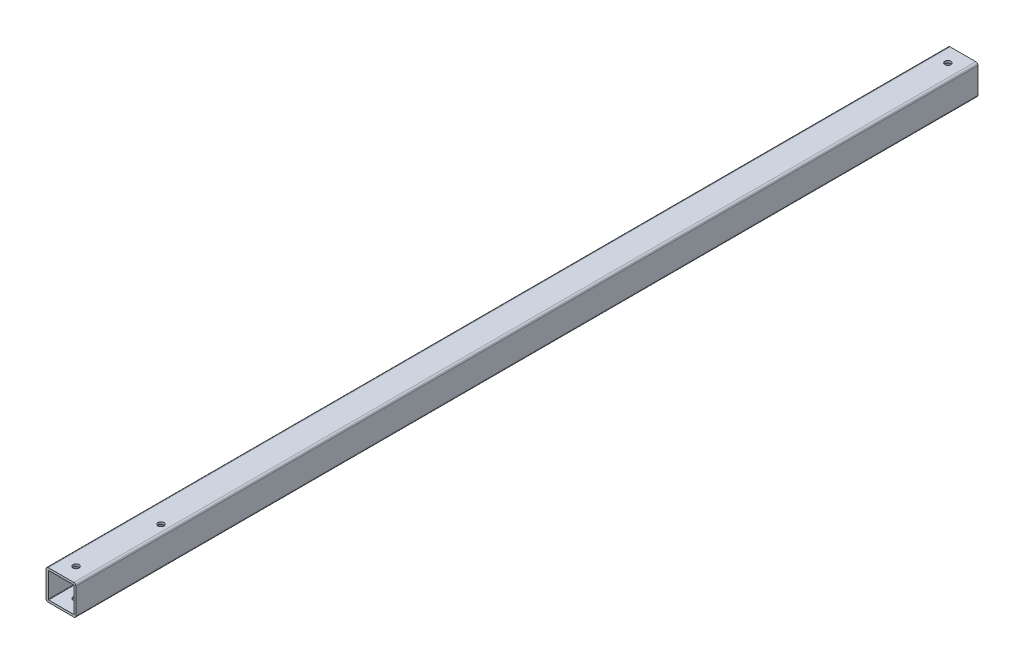
ISO-10303-21;
HEADER;
FILE_DESCRIPTION(('STEP AP214'),'2;1');
FILE_NAME('part.step','',(''),(''),'','','');
FILE_SCHEMA(('AUTOMOTIVE_DESIGN { 1 0 10303 214 1 1 1 1 }'));
ENDSEC;
DATA;
#1=APPLICATION_CONTEXT('core data for automotive mechanical design processes');
#2=APPLICATION_PROTOCOL_DEFINITION('international standard','automotive_design',2000,#1);
#3=PRODUCT_CONTEXT('',#1,'mechanical');
#4=PRODUCT('Part','Part','',(#3));
#5=PRODUCT_RELATED_PRODUCT_CATEGORY('part','',(#4));
#6=PRODUCT_DEFINITION_FORMATION('','',#4);
#7=PRODUCT_DEFINITION_CONTEXT('part definition',#1,'design');
#8=PRODUCT_DEFINITION('design','',#6,#7);
#9=PRODUCT_DEFINITION_SHAPE('','',#8);
#10=(LENGTH_UNIT() NAMED_UNIT(*) SI_UNIT(.MILLI.,.METRE.));
#11=(NAMED_UNIT(*) PLANE_ANGLE_UNIT() SI_UNIT($,.RADIAN.));
#12=(NAMED_UNIT(*) SI_UNIT($,.STERADIAN.) SOLID_ANGLE_UNIT());
#13=UNCERTAINTY_MEASURE_WITH_UNIT(LENGTH_MEASURE(1.E-05),#10,'distance_accuracy_value','');
#14=(GEOMETRIC_REPRESENTATION_CONTEXT(3) GLOBAL_UNCERTAINTY_ASSIGNED_CONTEXT((#13)) GLOBAL_UNIT_ASSIGNED_CONTEXT((#10,
#11,#12)) REPRESENTATION_CONTEXT('',''));
#15=CARTESIAN_POINT('',(0.,0.,0.));
#16=DIRECTION('',(0.,0.,1.));
#17=DIRECTION('',(1.,0.,0.));
#18=AXIS2_PLACEMENT_3D('',#15,#16,#17);
#19=CARTESIAN_POINT('',(0.,0.,1200.));
#20=DIRECTION('',(0.,0.,1.));
#21=DIRECTION('',(1.,0.,0.));
#22=AXIS2_PLACEMENT_3D('',#19,#20,#21);
#23=PLANE('',#22);
#24=DIRECTION('',(1.,0.,0.));
#25=VECTOR('',#24,1.);
#26=CARTESIAN_POINT('',(-20.,-20.,1200.));
#27=LINE('',#26,#25);
#28=CARTESIAN_POINT('',(-17.,-20.,1200.));
#29=VERTEX_POINT('',#28);
#30=CARTESIAN_POINT('',(17.,-20.,1200.));
#31=VERTEX_POINT('',#30);
#32=EDGE_CURVE('E199',#29,#31,#27,.T.);
#33=ORIENTED_EDGE('',*,*,#32,.T.);
#34=CARTESIAN_POINT('',(17.,-17.,1200.));
#35=DIRECTION('',(0.,0.,1.));
#36=DIRECTION('',(1.,0.,0.));
#37=AXIS2_PLACEMENT_3D('',#34,#35,#36);
#38=CIRCLE('',#37,3.);
#39=CARTESIAN_POINT('',(20.,-17.,1200.));
#40=VERTEX_POINT('',#39);
#41=EDGE_CURVE('E258',#31,#40,#38,.T.);
#42=ORIENTED_EDGE('',*,*,#41,.T.);
#43=DIRECTION('',(0.,1.,0.));
#44=VECTOR('',#43,1.);
#45=CARTESIAN_POINT('',(20.,20.,1200.));
#46=LINE('',#45,#44);
#47=CARTESIAN_POINT('',(20.,17.,1200.));
#48=VERTEX_POINT('',#47);
#49=EDGE_CURVE('E311',#40,#48,#46,.T.);
#50=ORIENTED_EDGE('',*,*,#49,.T.);
#51=CARTESIAN_POINT('',(17.,17.,1200.));
#52=DIRECTION('',(0.,0.,1.));
#53=DIRECTION('',(1.,0.,0.));
#54=AXIS2_PLACEMENT_3D('',#51,#52,#53);
#55=CIRCLE('',#54,3.);
#56=CARTESIAN_POINT('',(17.,20.,1200.));
#57=VERTEX_POINT('',#56);
#58=EDGE_CURVE('E254',#48,#57,#55,.T.);
#59=ORIENTED_EDGE('',*,*,#58,.T.);
#60=DIRECTION('',(-1.,0.,0.));
#61=VECTOR('',#60,1.);
#62=CARTESIAN_POINT('',(-20.,20.,1200.));
#63=LINE('',#62,#61);
#64=CARTESIAN_POINT('',(-17.,20.,1200.));
#65=VERTEX_POINT('',#64);
#66=EDGE_CURVE('E314',#57,#65,#63,.T.);
#67=ORIENTED_EDGE('',*,*,#66,.T.);
#68=CARTESIAN_POINT('',(-17.,17.,1200.));
#69=DIRECTION('',(0.,0.,1.));
#70=DIRECTION('',(1.,0.,0.));
#71=AXIS2_PLACEMENT_3D('',#68,#69,#70);
#72=CIRCLE('',#71,3.);
#73=CARTESIAN_POINT('',(-20.,17.,1200.));
#74=VERTEX_POINT('',#73);
#75=EDGE_CURVE('E80',#65,#74,#72,.T.);
#76=ORIENTED_EDGE('',*,*,#75,.T.);
#77=DIRECTION('',(0.,-1.,0.));
#78=VECTOR('',#77,1.);
#79=CARTESIAN_POINT('',(-20.,20.,1200.));
#80=LINE('',#79,#78);
#81=CARTESIAN_POINT('',(-20.,-17.,1200.));
#82=VERTEX_POINT('',#81);
#83=EDGE_CURVE('E204',#74,#82,#80,.T.);
#84=ORIENTED_EDGE('',*,*,#83,.T.);
#85=CARTESIAN_POINT('',(-17.,-17.,1200.));
#86=DIRECTION('',(0.,0.,1.));
#87=DIRECTION('',(1.,0.,0.));
#88=AXIS2_PLACEMENT_3D('',#85,#86,#87);
#89=CIRCLE('',#88,3.);
#90=EDGE_CURVE('E256',#82,#29,#89,.T.);
#91=ORIENTED_EDGE('',*,*,#90,.T.);
#92=EDGE_LOOP('',(#33,#42,#50,#59,#67,#76,#84,#91));
#93=FACE_BOUND('',#92,.T.);
#94=DIRECTION('',(-1.,0.,0.));
#95=VECTOR('',#94,1.);
#96=CARTESIAN_POINT('',(-20.,17.,1200.));
#97=LINE('',#96,#95);
#98=CARTESIAN_POINT('',(16.5,17.,1200.));
#99=VERTEX_POINT('',#98);
#100=CARTESIAN_POINT('',(-16.5,17.,1200.));
#101=VERTEX_POINT('',#100);
#102=EDGE_CURVE('E298',#99,#101,#97,.T.);
#103=ORIENTED_EDGE('',*,*,#102,.F.);
#104=CARTESIAN_POINT('',(16.5,16.5,1200.));
#105=DIRECTION('',(0.,0.,1.));
#106=DIRECTION('',(1.,0.,0.));
#107=AXIS2_PLACEMENT_3D('',#104,#105,#106);
#108=CIRCLE('',#107,0.5);
#109=CARTESIAN_POINT('',(17.,16.5,1200.));
#110=VERTEX_POINT('',#109);
#111=EDGE_CURVE('E229',#99,#110,#108,.F.);
#112=ORIENTED_EDGE('',*,*,#111,.T.);
#113=DIRECTION('',(0.,1.,0.));
#114=VECTOR('',#113,1.);
#115=CARTESIAN_POINT('',(17.,20.,1200.));
#116=LINE('',#115,#114);
#117=CARTESIAN_POINT('',(17.,-16.5,1200.));
#118=VERTEX_POINT('',#117);
#119=EDGE_CURVE('E295',#118,#110,#116,.T.);
#120=ORIENTED_EDGE('',*,*,#119,.F.);
#121=CARTESIAN_POINT('',(16.5,-16.5,1200.));
#122=DIRECTION('',(0.,0.,1.));
#123=DIRECTION('',(1.,0.,0.));
#124=AXIS2_PLACEMENT_3D('',#121,#122,#123);
#125=CIRCLE('',#124,0.5);
#126=CARTESIAN_POINT('',(16.5,-17.,1200.));
#127=VERTEX_POINT('',#126);
#128=EDGE_CURVE('E233',#118,#127,#125,.F.);
#129=ORIENTED_EDGE('',*,*,#128,.T.);
#130=DIRECTION('',(1.,0.,0.));
#131=VECTOR('',#130,1.);
#132=CARTESIAN_POINT('',(-20.,-17.,1200.));
#133=LINE('',#132,#131);
#134=CARTESIAN_POINT('',(-16.5,-17.,1200.));
#135=VERTEX_POINT('',#134);
#136=EDGE_CURVE('E303',#135,#127,#133,.T.);
#137=ORIENTED_EDGE('',*,*,#136,.F.);
#138=CARTESIAN_POINT('',(-16.5,-16.5,1200.));
#139=DIRECTION('',(0.,0.,1.));
#140=DIRECTION('',(1.,0.,0.));
#141=AXIS2_PLACEMENT_3D('',#138,#139,#140);
#142=CIRCLE('',#141,0.5);
#143=CARTESIAN_POINT('',(-17.,-16.5,1200.));
#144=VERTEX_POINT('',#143);
#145=EDGE_CURVE('E185',#135,#144,#142,.F.);
#146=ORIENTED_EDGE('',*,*,#145,.T.);
#147=DIRECTION('',(0.,-1.,0.));
#148=VECTOR('',#147,1.);
#149=CARTESIAN_POINT('',(-17.,20.,1200.));
#150=LINE('',#149,#148);
#151=CARTESIAN_POINT('',(-17.,16.5,1200.));
#152=VERTEX_POINT('',#151);
#153=EDGE_CURVE('E301',#152,#144,#150,.T.);
#154=ORIENTED_EDGE('',*,*,#153,.F.);
#155=CARTESIAN_POINT('',(-16.5,16.5,1200.));
#156=DIRECTION('',(0.,0.,1.));
#157=DIRECTION('',(1.,0.,0.));
#158=AXIS2_PLACEMENT_3D('',#155,#156,#157);
#159=CIRCLE('',#158,0.5);
#160=EDGE_CURVE('E184',#152,#101,#159,.F.);
#161=ORIENTED_EDGE('',*,*,#160,.T.);
#162=EDGE_LOOP('',(#103,#112,#120,#129,#137,#146,#154,#161));
#163=FACE_BOUND('',#162,.T.);
#164=ADVANCED_FACE('F56',(#93,#163),#23,.T.);
#165=CARTESIAN_POINT('',(0.,0.,0.));
#166=DIRECTION('',(0.,0.,1.));
#167=DIRECTION('',(1.,0.,0.));
#168=AXIS2_PLACEMENT_3D('',#165,#166,#167);
#169=PLANE('',#168);
#170=DIRECTION('',(0.,1.,0.));
#171=VECTOR('',#170,1.);
#172=CARTESIAN_POINT('',(20.,20.,0.));
#173=LINE('',#172,#171);
#174=CARTESIAN_POINT('',(20.,-17.,0.));
#175=VERTEX_POINT('',#174);
#176=CARTESIAN_POINT('',(20.,17.,0.));
#177=VERTEX_POINT('',#176);
#178=EDGE_CURVE('E306',#175,#177,#173,.T.);
#179=ORIENTED_EDGE('',*,*,#178,.F.);
#180=CARTESIAN_POINT('',(17.,-17.,0.));
#181=DIRECTION('',(0.,0.,1.));
#182=DIRECTION('',(1.,0.,0.));
#183=AXIS2_PLACEMENT_3D('',#180,#181,#182);
#184=CIRCLE('',#183,3.);
#185=CARTESIAN_POINT('',(17.,-20.,0.));
#186=VERTEX_POINT('',#185);
#187=EDGE_CURVE('E246',#175,#186,#184,.F.);
#188=ORIENTED_EDGE('',*,*,#187,.T.);
#189=DIRECTION('',(1.,0.,0.));
#190=VECTOR('',#189,1.);
#191=CARTESIAN_POINT('',(-20.,-20.,0.));
#192=LINE('',#191,#190);
#193=CARTESIAN_POINT('',(-17.,-20.,0.));
#194=VERTEX_POINT('',#193);
#195=EDGE_CURVE('E207',#194,#186,#192,.T.);
#196=ORIENTED_EDGE('',*,*,#195,.F.);
#197=CARTESIAN_POINT('',(-17.,-17.,0.));
#198=DIRECTION('',(0.,0.,1.));
#199=DIRECTION('',(1.,0.,0.));
#200=AXIS2_PLACEMENT_3D('',#197,#198,#199);
#201=CIRCLE('',#200,3.);
#202=CARTESIAN_POINT('',(-20.,-17.,0.));
#203=VERTEX_POINT('',#202);
#204=EDGE_CURVE('E244',#194,#203,#201,.F.);
#205=ORIENTED_EDGE('',*,*,#204,.T.);
#206=DIRECTION('',(0.,-1.,0.));
#207=VECTOR('',#206,1.);
#208=CARTESIAN_POINT('',(-20.,20.,0.));
#209=LINE('',#208,#207);
#210=CARTESIAN_POINT('',(-20.,17.,0.));
#211=VERTEX_POINT('',#210);
#212=EDGE_CURVE('E321',#211,#203,#209,.T.);
#213=ORIENTED_EDGE('',*,*,#212,.F.);
#214=CARTESIAN_POINT('',(-17.,17.,0.));
#215=DIRECTION('',(0.,0.,1.));
#216=DIRECTION('',(1.,0.,0.));
#217=AXIS2_PLACEMENT_3D('',#214,#215,#216);
#218=CIRCLE('',#217,3.);
#219=CARTESIAN_POINT('',(-17.,20.,0.));
#220=VERTEX_POINT('',#219);
#221=EDGE_CURVE('E240',#211,#220,#218,.F.);
#222=ORIENTED_EDGE('',*,*,#221,.T.);
#223=DIRECTION('',(-1.,0.,0.));
#224=VECTOR('',#223,1.);
#225=CARTESIAN_POINT('',(-20.,20.,0.));
#226=LINE('',#225,#224);
#227=CARTESIAN_POINT('',(17.,20.,0.));
#228=VERTEX_POINT('',#227);
#229=EDGE_CURVE('E319',#228,#220,#226,.T.);
#230=ORIENTED_EDGE('',*,*,#229,.F.);
#231=CARTESIAN_POINT('',(17.,17.,0.));
#232=DIRECTION('',(0.,0.,1.));
#233=DIRECTION('',(1.,0.,0.));
#234=AXIS2_PLACEMENT_3D('',#231,#232,#233);
#235=CIRCLE('',#234,3.);
#236=EDGE_CURVE('E242',#228,#177,#235,.F.);
#237=ORIENTED_EDGE('',*,*,#236,.T.);
#238=EDGE_LOOP('',(#179,#188,#196,#205,#213,#222,#230,#237));
#239=FACE_BOUND('',#238,.T.);
#240=DIRECTION('',(1.,0.,0.));
#241=VECTOR('',#240,1.);
#242=CARTESIAN_POINT('',(-20.,-17.,0.));
#243=LINE('',#242,#241);
#244=CARTESIAN_POINT('',(-16.5,-17.,0.));
#245=VERTEX_POINT('',#244);
#246=CARTESIAN_POINT('',(16.5,-17.,0.));
#247=VERTEX_POINT('',#246);
#248=EDGE_CURVE('E195',#245,#247,#243,.T.);
#249=ORIENTED_EDGE('',*,*,#248,.T.);
#250=CARTESIAN_POINT('',(16.5,-16.5,0.));
#251=DIRECTION('',(0.,0.,1.));
#252=DIRECTION('',(1.,0.,0.));
#253=AXIS2_PLACEMENT_3D('',#250,#251,#252);
#254=CIRCLE('',#253,0.5);
#255=CARTESIAN_POINT('',(17.,-16.5,0.));
#256=VERTEX_POINT('',#255);
#257=EDGE_CURVE('E231',#247,#256,#254,.T.);
#258=ORIENTED_EDGE('',*,*,#257,.T.);
#259=DIRECTION('',(0.,1.,0.));
#260=VECTOR('',#259,1.);
#261=CARTESIAN_POINT('',(17.,20.,0.));
#262=LINE('',#261,#260);
#263=CARTESIAN_POINT('',(17.,16.5,0.));
#264=VERTEX_POINT('',#263);
#265=EDGE_CURVE('E294',#256,#264,#262,.T.);
#266=ORIENTED_EDGE('',*,*,#265,.T.);
#267=CARTESIAN_POINT('',(16.5,16.5,0.));
#268=DIRECTION('',(0.,0.,1.));
#269=DIRECTION('',(1.,0.,0.));
#270=AXIS2_PLACEMENT_3D('',#267,#268,#269);
#271=CIRCLE('',#270,0.5);
#272=CARTESIAN_POINT('',(16.5,17.,0.));
#273=VERTEX_POINT('',#272);
#274=EDGE_CURVE('E227',#264,#273,#271,.T.);
#275=ORIENTED_EDGE('',*,*,#274,.T.);
#276=DIRECTION('',(-1.,0.,0.));
#277=VECTOR('',#276,1.);
#278=CARTESIAN_POINT('',(-20.,17.,0.));
#279=LINE('',#278,#277);
#280=CARTESIAN_POINT('',(-16.5,17.,0.));
#281=VERTEX_POINT('',#280);
#282=EDGE_CURVE('E179',#273,#281,#279,.T.);
#283=ORIENTED_EDGE('',*,*,#282,.T.);
#284=CARTESIAN_POINT('',(-16.5,16.5,0.));
#285=DIRECTION('',(0.,0.,1.));
#286=DIRECTION('',(1.,0.,0.));
#287=AXIS2_PLACEMENT_3D('',#284,#285,#286);
#288=CIRCLE('',#287,0.5);
#289=CARTESIAN_POINT('',(-17.,16.5,0.));
#290=VERTEX_POINT('',#289);
#291=EDGE_CURVE('E173',#281,#290,#288,.T.);
#292=ORIENTED_EDGE('',*,*,#291,.T.);
#293=DIRECTION('',(0.,-1.,0.));
#294=VECTOR('',#293,1.);
#295=CARTESIAN_POINT('',(-17.,20.,0.));
#296=LINE('',#295,#294);
#297=CARTESIAN_POINT('',(-17.,-16.5,0.));
#298=VERTEX_POINT('',#297);
#299=EDGE_CURVE('E177',#290,#298,#296,.T.);
#300=ORIENTED_EDGE('',*,*,#299,.T.);
#301=CARTESIAN_POINT('',(-16.5,-16.5,0.));
#302=DIRECTION('',(0.,0.,1.));
#303=DIRECTION('',(1.,0.,0.));
#304=AXIS2_PLACEMENT_3D('',#301,#302,#303);
#305=CIRCLE('',#304,0.5);
#306=EDGE_CURVE('E223',#298,#245,#305,.T.);
#307=ORIENTED_EDGE('',*,*,#306,.T.);
#308=EDGE_LOOP('',(#249,#258,#266,#275,#283,#292,#300,#307));
#309=FACE_BOUND('',#308,.T.);
#310=ADVANCED_FACE('F176',(#239,#309),#169,.F.);
#311=CARTESIAN_POINT('',(20.,20.,1200.));
#312=DIRECTION('',(-1.,0.,0.));
#313=DIRECTION('',(0.,-1.,0.));
#314=AXIS2_PLACEMENT_3D('',#311,#312,#313);
#315=PLANE('',#314);
#316=ORIENTED_EDGE('',*,*,#49,.F.);
#317=DIRECTION('',(0.,0.,-1.));
#318=VECTOR('',#317,1.);
#319=CARTESIAN_POINT('',(20.,-17.,1200.));
#320=LINE('',#319,#318);
#321=EDGE_CURVE('E237',#40,#175,#320,.T.);
#322=ORIENTED_EDGE('',*,*,#321,.T.);
#323=ORIENTED_EDGE('',*,*,#178,.T.);
#324=DIRECTION('',(0.,0.,-1.));
#325=VECTOR('',#324,1.);
#326=CARTESIAN_POINT('',(20.,17.,1200.));
#327=LINE('',#326,#325);
#328=EDGE_CURVE('E235',#177,#48,#327,.F.);
#329=ORIENTED_EDGE('',*,*,#328,.T.);
#330=EDGE_LOOP('',(#316,#322,#323,#329));
#331=FACE_BOUND('',#330,.T.);
#332=ADVANCED_FACE('F339',(#331),#315,.F.);
#333=CARTESIAN_POINT('',(-20.,20.,1200.));
#334=DIRECTION('',(0.,-1.,0.));
#335=DIRECTION('',(0.,0.,-1.));
#336=AXIS2_PLACEMENT_3D('',#333,#334,#335);
#337=PLANE('',#336);
#338=CARTESIAN_POINT('',(8.,20.,1075.));
#339=DIRECTION('',(0.,1.,0.));
#340=DIRECTION('',(0.,0.,1.));
#341=AXIS2_PLACEMENT_3D('',#338,#339,#340);
#342=CIRCLE('',#341,4.);
#343=CARTESIAN_POINT('',(8.,20.,1079.));
#344=VERTEX_POINT('',#343);
#345=EDGE_CURVE('E456',#344,#344,#342,.T.);
#346=ORIENTED_EDGE('',*,*,#345,.F.);
#347=EDGE_LOOP('',(#346));
#348=FACE_BOUND('',#347,.T.);
#349=CARTESIAN_POINT('',(0.,20.,20.));
#350=DIRECTION('',(0.,1.,0.));
#351=DIRECTION('',(0.,0.,1.));
#352=AXIS2_PLACEMENT_3D('',#349,#350,#351);
#353=CIRCLE('',#352,3.99999999999999);
#354=CARTESIAN_POINT('',(0.,20.,24.));
#355=VERTEX_POINT('',#354);
#356=EDGE_CURVE('E274',#355,#355,#353,.T.);
#357=ORIENTED_EDGE('',*,*,#356,.F.);
#358=EDGE_LOOP('',(#357));
#359=FACE_BOUND('',#358,.T.);
#360=CARTESIAN_POINT('',(1.44508322299388E-13,20.,1180.));
#361=DIRECTION('',(0.,1.,0.));
#362=DIRECTION('',(0.,0.,1.));
#363=AXIS2_PLACEMENT_3D('',#360,#361,#362);
#364=CIRCLE('',#363,3.99999999999999);
#365=CARTESIAN_POINT('',(1.44508322299388E-13,20.,1184.));
#366=VERTEX_POINT('',#365);
#367=EDGE_CURVE('E271',#366,#366,#364,.T.);
#368=ORIENTED_EDGE('',*,*,#367,.F.);
#369=EDGE_LOOP('',(#368));
#370=FACE_BOUND('',#369,.T.);
#371=ORIENTED_EDGE('',*,*,#66,.F.);
#372=DIRECTION('',(0.,0.,-1.));
#373=VECTOR('',#372,1.);
#374=CARTESIAN_POINT('',(17.,20.,1200.));
#375=LINE('',#374,#373);
#376=EDGE_CURVE('E12',#57,#228,#375,.T.);
#377=ORIENTED_EDGE('',*,*,#376,.T.);
#378=ORIENTED_EDGE('',*,*,#229,.T.);
#379=DIRECTION('',(0.,0.,-1.));
#380=VECTOR('',#379,1.);
#381=CARTESIAN_POINT('',(-17.,20.,1200.));
#382=LINE('',#381,#380);
#383=EDGE_CURVE('E65',#220,#65,#382,.F.);
#384=ORIENTED_EDGE('',*,*,#383,.T.);
#385=EDGE_LOOP('',(#371,#377,#378,#384));
#386=FACE_BOUND('',#385,.T.);
#387=ADVANCED_FACE('F347',(#348,#359,#370,#386),#337,.F.);
#388=CARTESIAN_POINT('',(-20.,20.,1200.));
#389=DIRECTION('',(1.,0.,0.));
#390=DIRECTION('',(0.,1.,0.));
#391=AXIS2_PLACEMENT_3D('',#388,#389,#390);
#392=PLANE('',#391);
#393=ORIENTED_EDGE('',*,*,#212,.T.);
#394=DIRECTION('',(0.,0.,-1.));
#395=VECTOR('',#394,1.);
#396=CARTESIAN_POINT('',(-20.,-17.,1200.));
#397=LINE('',#396,#395);
#398=EDGE_CURVE('E73',#203,#82,#397,.F.);
#399=ORIENTED_EDGE('',*,*,#398,.T.);
#400=ORIENTED_EDGE('',*,*,#83,.F.);
#401=DIRECTION('',(0.,0.,-1.));
#402=VECTOR('',#401,1.);
#403=CARTESIAN_POINT('',(-20.,17.,1200.));
#404=LINE('',#403,#402);
#405=EDGE_CURVE('E260',#74,#211,#404,.T.);
#406=ORIENTED_EDGE('',*,*,#405,.T.);
#407=EDGE_LOOP('',(#393,#399,#400,#406));
#408=FACE_BOUND('',#407,.T.);
#409=ADVANCED_FACE('F352',(#408),#392,.F.);
#410=CARTESIAN_POINT('',(-20.,-20.,1200.));
#411=DIRECTION('',(0.,1.,0.));
#412=DIRECTION('',(0.,0.,1.));
#413=AXIS2_PLACEMENT_3D('',#410,#411,#412);
#414=PLANE('',#413);
#415=CARTESIAN_POINT('',(8.,-20.,1075.));
#416=DIRECTION('',(0.,1.,0.));
#417=DIRECTION('',(0.,0.,1.));
#418=AXIS2_PLACEMENT_3D('',#415,#416,#417);
#419=CIRCLE('',#418,4.);
#420=CARTESIAN_POINT('',(8.,-20.,1079.));
#421=VERTEX_POINT('',#420);
#422=EDGE_CURVE('E455',#421,#421,#419,.T.);
#423=ORIENTED_EDGE('',*,*,#422,.T.);
#424=EDGE_LOOP('',(#423));
#425=FACE_BOUND('',#424,.T.);
#426=CARTESIAN_POINT('',(0.,-20.,20.));
#427=DIRECTION('',(0.,1.,0.));
#428=DIRECTION('',(0.,0.,1.));
#429=AXIS2_PLACEMENT_3D('',#426,#427,#428);
#430=CIRCLE('',#429,3.99999999999999);
#431=CARTESIAN_POINT('',(0.,-20.,24.));
#432=VERTEX_POINT('',#431);
#433=EDGE_CURVE('E267',#432,#432,#430,.T.);
#434=ORIENTED_EDGE('',*,*,#433,.T.);
#435=EDGE_LOOP('',(#434));
#436=FACE_BOUND('',#435,.T.);
#437=CARTESIAN_POINT('',(1.44508322299388E-13,-20.,1180.));
#438=DIRECTION('',(0.,1.,0.));
#439=DIRECTION('',(0.,0.,1.));
#440=AXIS2_PLACEMENT_3D('',#437,#438,#439);
#441=CIRCLE('',#440,3.99999999999999);
#442=CARTESIAN_POINT('',(1.44508322299388E-13,-20.,1184.));
#443=VERTEX_POINT('',#442);
#444=EDGE_CURVE('E285',#443,#443,#441,.T.);
#445=ORIENTED_EDGE('',*,*,#444,.T.);
#446=EDGE_LOOP('',(#445));
#447=FACE_BOUND('',#446,.T.);
#448=ORIENTED_EDGE('',*,*,#195,.T.);
#449=DIRECTION('',(0.,0.,-1.));
#450=VECTOR('',#449,1.);
#451=CARTESIAN_POINT('',(17.,-20.,1200.));
#452=LINE('',#451,#450);
#453=EDGE_CURVE('E251',#186,#31,#452,.F.);
#454=ORIENTED_EDGE('',*,*,#453,.T.);
#455=ORIENTED_EDGE('',*,*,#32,.F.);
#456=DIRECTION('',(0.,0.,-1.));
#457=VECTOR('',#456,1.);
#458=CARTESIAN_POINT('',(-17.,-20.,1200.));
#459=LINE('',#458,#457);
#460=EDGE_CURVE('E248',#29,#194,#459,.T.);
#461=ORIENTED_EDGE('',*,*,#460,.T.);
#462=EDGE_LOOP('',(#448,#454,#455,#461));
#463=FACE_BOUND('',#462,.T.);
#464=ADVANCED_FACE('F327',(#425,#436,#447,#463),#414,.F.);
#465=CARTESIAN_POINT('',(17.,20.,1200.));
#466=DIRECTION('',(-1.,0.,0.));
#467=DIRECTION('',(0.,-1.,0.));
#468=AXIS2_PLACEMENT_3D('',#465,#466,#467);
#469=PLANE('',#468);
#470=ORIENTED_EDGE('',*,*,#119,.T.);
#471=DIRECTION('',(0.,0.,-1.));
#472=VECTOR('',#471,1.);
#473=CARTESIAN_POINT('',(17.,16.5,0.));
#474=LINE('',#473,#472);
#475=EDGE_CURVE('E220',#110,#264,#474,.T.);
#476=ORIENTED_EDGE('',*,*,#475,.T.);
#477=ORIENTED_EDGE('',*,*,#265,.F.);
#478=DIRECTION('',(0.,0.,-1.));
#479=VECTOR('',#478,1.);
#480=CARTESIAN_POINT('',(17.,-16.5,1200.));
#481=LINE('',#480,#479);
#482=EDGE_CURVE('E218',#256,#118,#481,.F.);
#483=ORIENTED_EDGE('',*,*,#482,.T.);
#484=EDGE_LOOP('',(#470,#476,#477,#483));
#485=FACE_BOUND('',#484,.T.);
#486=ADVANCED_FACE('F371',(#485),#469,.T.);
#487=CARTESIAN_POINT('',(-20.,17.,1200.));
#488=DIRECTION('',(0.,-1.,0.));
#489=DIRECTION('',(0.,0.,-1.));
#490=AXIS2_PLACEMENT_3D('',#487,#488,#489);
#491=PLANE('',#490);
#492=CARTESIAN_POINT('',(8.,17.,1075.));
#493=DIRECTION('',(0.,-1.,0.));
#494=DIRECTION('',(0.,0.,-1.));
#495=AXIS2_PLACEMENT_3D('',#492,#493,#494);
#496=CIRCLE('',#495,4.);
#497=CARTESIAN_POINT('',(8.,17.,1071.));
#498=VERTEX_POINT('',#497);
#499=EDGE_CURVE('E279',#498,#498,#496,.T.);
#500=ORIENTED_EDGE('',*,*,#499,.F.);
#501=EDGE_LOOP('',(#500));
#502=FACE_BOUND('',#501,.T.);
#503=CARTESIAN_POINT('',(0.,17.,20.));
#504=DIRECTION('',(0.,-1.,0.));
#505=DIRECTION('',(0.,0.,-1.));
#506=AXIS2_PLACEMENT_3D('',#503,#504,#505);
#507=CIRCLE('',#506,3.99999999999999);
#508=CARTESIAN_POINT('',(0.,17.,16.));
#509=VERTEX_POINT('',#508);
#510=EDGE_CURVE('E266',#509,#509,#507,.T.);
#511=ORIENTED_EDGE('',*,*,#510,.F.);
#512=EDGE_LOOP('',(#511));
#513=FACE_BOUND('',#512,.T.);
#514=CARTESIAN_POINT('',(1.44508322299388E-13,17.,1180.));
#515=DIRECTION('',(0.,-1.,0.));
#516=DIRECTION('',(0.,0.,-1.));
#517=AXIS2_PLACEMENT_3D('',#514,#515,#516);
#518=CIRCLE('',#517,3.99999999999999);
#519=CARTESIAN_POINT('',(1.44508322299388E-13,17.,1176.));
#520=VERTEX_POINT('',#519);
#521=EDGE_CURVE('E288',#520,#520,#518,.T.);
#522=ORIENTED_EDGE('',*,*,#521,.F.);
#523=EDGE_LOOP('',(#522));
#524=FACE_BOUND('',#523,.T.);
#525=ORIENTED_EDGE('',*,*,#102,.T.);
#526=DIRECTION('',(0.,0.,-1.));
#527=VECTOR('',#526,1.);
#528=CARTESIAN_POINT('',(-16.5,17.,0.));
#529=LINE('',#528,#527);
#530=EDGE_CURVE('E216',#101,#281,#529,.T.);
#531=ORIENTED_EDGE('',*,*,#530,.T.);
#532=ORIENTED_EDGE('',*,*,#282,.F.);
#533=DIRECTION('',(0.,0.,-1.));
#534=VECTOR('',#533,1.);
#535=CARTESIAN_POINT('',(16.5,17.,1200.));
#536=LINE('',#535,#534);
#537=EDGE_CURVE('E214',#273,#99,#536,.F.);
#538=ORIENTED_EDGE('',*,*,#537,.T.);
#539=EDGE_LOOP('',(#525,#531,#532,#538));
#540=FACE_BOUND('',#539,.T.);
#541=ADVANCED_FACE('F411',(#502,#513,#524,#540),#491,.T.);
#542=CARTESIAN_POINT('',(-17.,20.,1200.));
#543=DIRECTION('',(1.,0.,0.));
#544=DIRECTION('',(0.,1.,0.));
#545=AXIS2_PLACEMENT_3D('',#542,#543,#544);
#546=PLANE('',#545);
#547=ORIENTED_EDGE('',*,*,#153,.T.);
#548=DIRECTION('',(0.,0.,-1.));
#549=VECTOR('',#548,1.);
#550=CARTESIAN_POINT('',(-17.,-16.5,0.));
#551=LINE('',#550,#549);
#552=EDGE_CURVE('E194',#144,#298,#551,.T.);
#553=ORIENTED_EDGE('',*,*,#552,.T.);
#554=ORIENTED_EDGE('',*,*,#299,.F.);
#555=DIRECTION('',(0.,0.,-1.));
#556=VECTOR('',#555,1.);
#557=CARTESIAN_POINT('',(-17.,16.5,1200.));
#558=LINE('',#557,#556);
#559=EDGE_CURVE('E191',#290,#152,#558,.F.);
#560=ORIENTED_EDGE('',*,*,#559,.T.);
#561=EDGE_LOOP('',(#547,#553,#554,#560));
#562=FACE_BOUND('',#561,.T.);
#563=ADVANCED_FACE('F190',(#562),#546,.T.);
#564=CARTESIAN_POINT('',(-20.,-17.,1200.));
#565=DIRECTION('',(0.,1.,0.));
#566=DIRECTION('',(0.,0.,1.));
#567=AXIS2_PLACEMENT_3D('',#564,#565,#566);
#568=PLANE('',#567);
#569=CARTESIAN_POINT('',(8.,-17.,1075.));
#570=DIRECTION('',(0.,1.,0.));
#571=DIRECTION('',(0.,0.,1.));
#572=AXIS2_PLACEMENT_3D('',#569,#570,#571);
#573=CIRCLE('',#572,4.);
#574=CARTESIAN_POINT('',(8.,-17.,1079.));
#575=VERTEX_POINT('',#574);
#576=EDGE_CURVE('E60',#575,#575,#573,.T.);
#577=ORIENTED_EDGE('',*,*,#576,.F.);
#578=EDGE_LOOP('',(#577));
#579=FACE_BOUND('',#578,.T.);
#580=CARTESIAN_POINT('',(0.,-17.,20.));
#581=DIRECTION('',(0.,1.,0.));
#582=DIRECTION('',(0.,0.,1.));
#583=AXIS2_PLACEMENT_3D('',#580,#581,#582);
#584=CIRCLE('',#583,3.99999999999999);
#585=CARTESIAN_POINT('',(0.,-17.,24.));
#586=VERTEX_POINT('',#585);
#587=EDGE_CURVE('E264',#586,#586,#584,.T.);
#588=ORIENTED_EDGE('',*,*,#587,.F.);
#589=EDGE_LOOP('',(#588));
#590=FACE_BOUND('',#589,.T.);
#591=CARTESIAN_POINT('',(1.44508322299388E-13,-17.,1180.));
#592=DIRECTION('',(0.,1.,0.));
#593=DIRECTION('',(0.,0.,1.));
#594=AXIS2_PLACEMENT_3D('',#591,#592,#593);
#595=CIRCLE('',#594,3.99999999999999);
#596=CARTESIAN_POINT('',(1.44508322299388E-13,-17.,1184.));
#597=VERTEX_POINT('',#596);
#598=EDGE_CURVE('E291',#597,#597,#595,.T.);
#599=ORIENTED_EDGE('',*,*,#598,.F.);
#600=EDGE_LOOP('',(#599));
#601=FACE_BOUND('',#600,.T.);
#602=ORIENTED_EDGE('',*,*,#248,.F.);
#603=DIRECTION('',(0.,0.,-1.));
#604=VECTOR('',#603,1.);
#605=CARTESIAN_POINT('',(-16.5,-17.,1200.));
#606=LINE('',#605,#604);
#607=EDGE_CURVE('E212',#245,#135,#606,.F.);
#608=ORIENTED_EDGE('',*,*,#607,.T.);
#609=ORIENTED_EDGE('',*,*,#136,.T.);
#610=DIRECTION('',(0.,0.,-1.));
#611=VECTOR('',#610,1.);
#612=CARTESIAN_POINT('',(16.5,-17.,0.));
#613=LINE('',#612,#611);
#614=EDGE_CURVE('E201',#127,#247,#613,.T.);
#615=ORIENTED_EDGE('',*,*,#614,.T.);
#616=EDGE_LOOP('',(#602,#608,#609,#615));
#617=FACE_BOUND('',#616,.T.);
#618=ADVANCED_FACE('F387',(#579,#590,#601,#617),#568,.T.);
#619=CARTESIAN_POINT('',(-16.5,-16.5,1200.));
#620=DIRECTION('',(0.,0.,1.));
#621=DIRECTION('',(1.,0.,0.));
#622=AXIS2_PLACEMENT_3D('',#619,#620,#621);
#623=CYLINDRICAL_SURFACE('',#622,0.5);
#624=ORIENTED_EDGE('',*,*,#145,.F.);
#625=ORIENTED_EDGE('',*,*,#607,.F.);
#626=ORIENTED_EDGE('',*,*,#306,.F.);
#627=ORIENTED_EDGE('',*,*,#552,.F.);
#628=EDGE_LOOP('',(#624,#625,#626,#627));
#629=FACE_BOUND('',#628,.T.);
#630=ADVANCED_FACE('F384',(#629),#623,.F.);
#631=CARTESIAN_POINT('',(-16.5,16.5,1200.));
#632=DIRECTION('',(0.,0.,1.));
#633=DIRECTION('',(1.,0.,0.));
#634=AXIS2_PLACEMENT_3D('',#631,#632,#633);
#635=CYLINDRICAL_SURFACE('',#634,0.5);
#636=ORIENTED_EDGE('',*,*,#160,.F.);
#637=ORIENTED_EDGE('',*,*,#559,.F.);
#638=ORIENTED_EDGE('',*,*,#291,.F.);
#639=ORIENTED_EDGE('',*,*,#530,.F.);
#640=EDGE_LOOP('',(#636,#637,#638,#639));
#641=FACE_BOUND('',#640,.T.);
#642=ADVANCED_FACE('F198',(#641),#635,.F.);
#643=CARTESIAN_POINT('',(16.5,16.5,1200.));
#644=DIRECTION('',(0.,0.,1.));
#645=DIRECTION('',(1.,0.,0.));
#646=AXIS2_PLACEMENT_3D('',#643,#644,#645);
#647=CYLINDRICAL_SURFACE('',#646,0.5);
#648=ORIENTED_EDGE('',*,*,#111,.F.);
#649=ORIENTED_EDGE('',*,*,#537,.F.);
#650=ORIENTED_EDGE('',*,*,#274,.F.);
#651=ORIENTED_EDGE('',*,*,#475,.F.);
#652=EDGE_LOOP('',(#648,#649,#650,#651));
#653=FACE_BOUND('',#652,.T.);
#654=ADVANCED_FACE('F391',(#653),#647,.F.);
#655=CARTESIAN_POINT('',(16.5,-16.5,1200.));
#656=DIRECTION('',(0.,0.,1.));
#657=DIRECTION('',(1.,0.,0.));
#658=AXIS2_PLACEMENT_3D('',#655,#656,#657);
#659=CYLINDRICAL_SURFACE('',#658,0.5);
#660=ORIENTED_EDGE('',*,*,#128,.F.);
#661=ORIENTED_EDGE('',*,*,#482,.F.);
#662=ORIENTED_EDGE('',*,*,#257,.F.);
#663=ORIENTED_EDGE('',*,*,#614,.F.);
#664=EDGE_LOOP('',(#660,#661,#662,#663));
#665=FACE_BOUND('',#664,.T.);
#666=ADVANCED_FACE('F362',(#665),#659,.F.);
#667=CARTESIAN_POINT('',(17.,-17.,1200.));
#668=DIRECTION('',(0.,0.,-1.));
#669=DIRECTION('',(-1.,0.,0.));
#670=AXIS2_PLACEMENT_3D('',#667,#668,#669);
#671=CYLINDRICAL_SURFACE('',#670,3.);
#672=ORIENTED_EDGE('',*,*,#41,.F.);
#673=ORIENTED_EDGE('',*,*,#453,.F.);
#674=ORIENTED_EDGE('',*,*,#187,.F.);
#675=ORIENTED_EDGE('',*,*,#321,.F.);
#676=EDGE_LOOP('',(#672,#673,#674,#675));
#677=FACE_BOUND('',#676,.T.);
#678=ADVANCED_FACE('F333',(#677),#671,.T.);
#679=CARTESIAN_POINT('',(-17.,-17.,1200.));
#680=DIRECTION('',(0.,0.,-1.));
#681=DIRECTION('',(-1.,0.,0.));
#682=AXIS2_PLACEMENT_3D('',#679,#680,#681);
#683=CYLINDRICAL_SURFACE('',#682,3.);
#684=ORIENTED_EDGE('',*,*,#90,.F.);
#685=ORIENTED_EDGE('',*,*,#398,.F.);
#686=ORIENTED_EDGE('',*,*,#204,.F.);
#687=ORIENTED_EDGE('',*,*,#460,.F.);
#688=EDGE_LOOP('',(#684,#685,#686,#687));
#689=FACE_BOUND('',#688,.T.);
#690=ADVANCED_FACE('F355',(#689),#683,.T.);
#691=CARTESIAN_POINT('',(17.,17.,1200.));
#692=DIRECTION('',(0.,0.,-1.));
#693=DIRECTION('',(-1.,0.,0.));
#694=AXIS2_PLACEMENT_3D('',#691,#692,#693);
#695=CYLINDRICAL_SURFACE('',#694,3.);
#696=ORIENTED_EDGE('',*,*,#58,.F.);
#697=ORIENTED_EDGE('',*,*,#328,.F.);
#698=ORIENTED_EDGE('',*,*,#236,.F.);
#699=ORIENTED_EDGE('',*,*,#376,.F.);
#700=EDGE_LOOP('',(#696,#697,#698,#699));
#701=FACE_BOUND('',#700,.T.);
#702=ADVANCED_FACE('F343',(#701),#695,.T.);
#703=CARTESIAN_POINT('',(-17.,17.,1200.));
#704=DIRECTION('',(0.,0.,-1.));
#705=DIRECTION('',(-1.,0.,0.));
#706=AXIS2_PLACEMENT_3D('',#703,#704,#705);
#707=CYLINDRICAL_SURFACE('',#706,3.);
#708=ORIENTED_EDGE('',*,*,#75,.F.);
#709=ORIENTED_EDGE('',*,*,#383,.F.);
#710=ORIENTED_EDGE('',*,*,#221,.F.);
#711=ORIENTED_EDGE('',*,*,#405,.F.);
#712=EDGE_LOOP('',(#708,#709,#710,#711));
#713=FACE_BOUND('',#712,.T.);
#714=ADVANCED_FACE('F58',(#713),#707,.T.);
#715=CARTESIAN_POINT('',(1.44508322299388E-13,20.,1180.));
#716=DIRECTION('',(0.,1.,0.));
#717=DIRECTION('',(0.,0.,1.));
#718=AXIS2_PLACEMENT_3D('',#715,#716,#717);
#719=CYLINDRICAL_SURFACE('',#718,3.99999999999999);
#720=ORIENTED_EDGE('',*,*,#521,.T.);
#721=EDGE_LOOP('',(#720));
#722=FACE_BOUND('',#721,.T.);
#723=ORIENTED_EDGE('',*,*,#367,.T.);
#724=EDGE_LOOP('',(#723));
#725=FACE_BOUND('',#724,.T.);
#726=ADVANCED_FACE('F431',(#722,#725),#719,.F.);
#727=ORIENTED_EDGE('',*,*,#598,.T.);
#728=EDGE_LOOP('',(#727));
#729=FACE_BOUND('',#728,.T.);
#730=ORIENTED_EDGE('',*,*,#444,.F.);
#731=EDGE_LOOP('',(#730));
#732=FACE_BOUND('',#731,.T.);
#733=ADVANCED_FACE('F434',(#729,#732),#719,.F.);
#734=CARTESIAN_POINT('',(0.,20.,20.));
#735=DIRECTION('',(0.,1.,0.));
#736=DIRECTION('',(0.,0.,1.));
#737=AXIS2_PLACEMENT_3D('',#734,#735,#736);
#738=CYLINDRICAL_SURFACE('',#737,3.99999999999999);
#739=ORIENTED_EDGE('',*,*,#587,.T.);
#740=EDGE_LOOP('',(#739));
#741=FACE_BOUND('',#740,.T.);
#742=ORIENTED_EDGE('',*,*,#433,.F.);
#743=EDGE_LOOP('',(#742));
#744=FACE_BOUND('',#743,.T.);
#745=ADVANCED_FACE('F436',(#741,#744),#738,.F.);
#746=ORIENTED_EDGE('',*,*,#510,.T.);
#747=EDGE_LOOP('',(#746));
#748=FACE_BOUND('',#747,.T.);
#749=ORIENTED_EDGE('',*,*,#356,.T.);
#750=EDGE_LOOP('',(#749));
#751=FACE_BOUND('',#750,.T.);
#752=ADVANCED_FACE('F439',(#748,#751),#738,.F.);
#753=CARTESIAN_POINT('',(8.,-20.,1075.));
#754=DIRECTION('',(0.,1.,0.));
#755=DIRECTION('',(0.,0.,1.));
#756=AXIS2_PLACEMENT_3D('',#753,#754,#755);
#757=CYLINDRICAL_SURFACE('',#756,4.);
#758=ORIENTED_EDGE('',*,*,#576,.T.);
#759=EDGE_LOOP('',(#758));
#760=FACE_BOUND('',#759,.T.);
#761=ORIENTED_EDGE('',*,*,#422,.F.);
#762=EDGE_LOOP('',(#761));
#763=FACE_BOUND('',#762,.T.);
#764=ADVANCED_FACE('F440',(#760,#763),#757,.F.);
#765=ORIENTED_EDGE('',*,*,#499,.T.);
#766=EDGE_LOOP('',(#765));
#767=FACE_BOUND('',#766,.T.);
#768=ORIENTED_EDGE('',*,*,#345,.T.);
#769=EDGE_LOOP('',(#768));
#770=FACE_BOUND('',#769,.T.);
#771=ADVANCED_FACE('F442',(#767,#770),#757,.F.);
#772=CLOSED_SHELL('',(#164,#310,#332,#387,#409,#464,#486,#541,#563,#618,#630,#642,#654,#666,
#678,#690,#702,#714,#726,#733,#745,#752,#764,#771));
#773=MANIFOLD_SOLID_BREP('B2',#772);
#774=ADVANCED_BREP_SHAPE_REPRESENTATION('',(#18,#773),#14);
#775=SHAPE_DEFINITION_REPRESENTATION(#9,#774);
ENDSEC;
END-ISO-10303-21;
